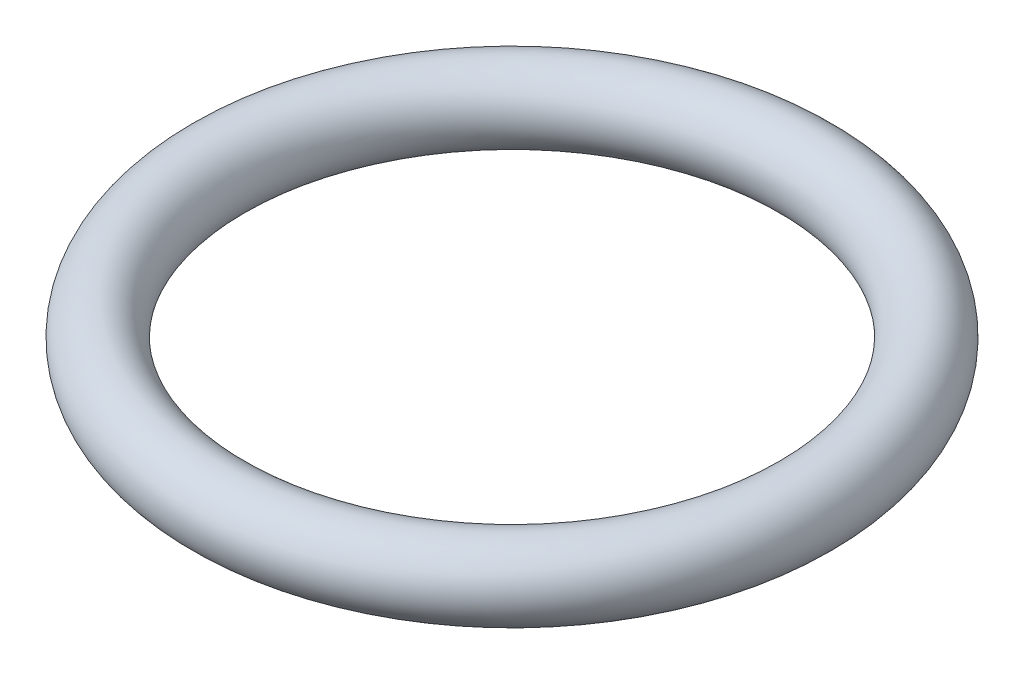
ISO-10303-21;
HEADER;
FILE_DESCRIPTION(('STEP AP214'),'2;1');
FILE_NAME('part.step','',(''),(''),'','','');
FILE_SCHEMA(('AUTOMOTIVE_DESIGN { 1 0 10303 214 1 1 1 1 }'));
ENDSEC;
DATA;
#1=APPLICATION_CONTEXT('core data for automotive mechanical design processes');
#2=APPLICATION_PROTOCOL_DEFINITION('international standard','automotive_design',2000,#1);
#3=PRODUCT_CONTEXT('',#1,'mechanical');
#4=PRODUCT('Part','Part','',(#3));
#5=PRODUCT_RELATED_PRODUCT_CATEGORY('part','',(#4));
#6=PRODUCT_DEFINITION_FORMATION('','',#4);
#7=PRODUCT_DEFINITION_CONTEXT('part definition',#1,'design');
#8=PRODUCT_DEFINITION('design','',#6,#7);
#9=PRODUCT_DEFINITION_SHAPE('','',#8);
#10=(LENGTH_UNIT() NAMED_UNIT(*) SI_UNIT(.MILLI.,.METRE.));
#11=(NAMED_UNIT(*) PLANE_ANGLE_UNIT() SI_UNIT($,.RADIAN.));
#12=(NAMED_UNIT(*) SI_UNIT($,.STERADIAN.) SOLID_ANGLE_UNIT());
#13=UNCERTAINTY_MEASURE_WITH_UNIT(LENGTH_MEASURE(1.E-05),#10,'distance_accuracy_value','');
#14=(GEOMETRIC_REPRESENTATION_CONTEXT(3) GLOBAL_UNCERTAINTY_ASSIGNED_CONTEXT((#13)) GLOBAL_UNIT_ASSIGNED_CONTEXT((#10,
#11,#12)) REPRESENTATION_CONTEXT('',''));
#15=CARTESIAN_POINT('',(0.,0.,0.));
#16=DIRECTION('',(0.,0.,1.));
#17=DIRECTION('',(1.,0.,0.));
#18=AXIS2_PLACEMENT_3D('',#15,#16,#17);
#19=CARTESIAN_POINT('',(0.,0.,0.));
#20=DIRECTION('',(0.,1.,0.));
#21=DIRECTION('',(-1.,0.,0.));
#22=AXIS2_PLACEMENT_3D('',#19,#20,#21);
#23=TOROIDAL_SURFACE('',#22,14.26,1.78);
#24=CARTESIAN_POINT('',(-16.04,0.,0.));
#25=VERTEX_POINT('',#24);
#26=VERTEX_LOOP('',#25);
#27=FACE_BOUND('',#26,.T.);
#28=ADVANCED_FACE('F33',(#27),#23,.T.);
#29=CLOSED_SHELL('',(#28));
#30=MANIFOLD_SOLID_BREP('B2',#29);
#31=ADVANCED_BREP_SHAPE_REPRESENTATION('',(#18,#30),#14);
#32=SHAPE_DEFINITION_REPRESENTATION(#9,#31);
ENDSEC;
END-ISO-10303-21;
